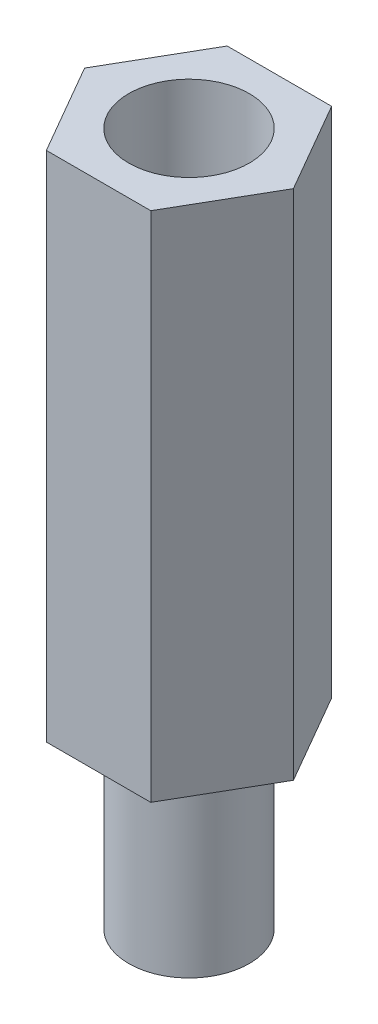
ISO-10303-21;
HEADER;
FILE_DESCRIPTION(('STEP AP214'),'2;1');
FILE_NAME('part.step','',(''),(''),'','','');
FILE_SCHEMA(('AUTOMOTIVE_DESIGN { 1 0 10303 214 1 1 1 1 }'));
ENDSEC;
DATA;
#1=APPLICATION_CONTEXT('core data for automotive mechanical design processes');
#2=APPLICATION_PROTOCOL_DEFINITION('international standard','automotive_design',2000,#1);
#3=PRODUCT_CONTEXT('',#1,'mechanical');
#4=PRODUCT('Part','Part','',(#3));
#5=PRODUCT_RELATED_PRODUCT_CATEGORY('part','',(#4));
#6=PRODUCT_DEFINITION_FORMATION('','',#4);
#7=PRODUCT_DEFINITION_CONTEXT('part definition',#1,'design');
#8=PRODUCT_DEFINITION('design','',#6,#7);
#9=PRODUCT_DEFINITION_SHAPE('','',#8);
#10=(LENGTH_UNIT() NAMED_UNIT(*) SI_UNIT(.MILLI.,.METRE.));
#11=(NAMED_UNIT(*) PLANE_ANGLE_UNIT() SI_UNIT($,.RADIAN.));
#12=(NAMED_UNIT(*) SI_UNIT($,.STERADIAN.) SOLID_ANGLE_UNIT());
#13=UNCERTAINTY_MEASURE_WITH_UNIT(LENGTH_MEASURE(1.E-05),#10,'distance_accuracy_value','');
#14=(GEOMETRIC_REPRESENTATION_CONTEXT(3) GLOBAL_UNCERTAINTY_ASSIGNED_CONTEXT((#13)) GLOBAL_UNIT_ASSIGNED_CONTEXT((#10,
#11,#12)) REPRESENTATION_CONTEXT('',''));
#15=CARTESIAN_POINT('',(0.,0.,0.));
#16=DIRECTION('',(0.,0.,1.));
#17=DIRECTION('',(1.,0.,0.));
#18=AXIS2_PLACEMENT_3D('',#15,#16,#17);
#19=CARTESIAN_POINT('',(0.,-6.,0.));
#20=DIRECTION('',(0.,1.,0.));
#21=DIRECTION('',(0.,0.,1.));
#22=AXIS2_PLACEMENT_3D('',#19,#20,#21);
#23=CYLINDRICAL_SURFACE('',#22,2.);
#24=CARTESIAN_POINT('',(0.,-6.,0.));
#25=DIRECTION('',(0.,1.,0.));
#26=DIRECTION('',(0.,0.,1.));
#27=AXIS2_PLACEMENT_3D('',#24,#25,#26);
#28=CIRCLE('',#27,2.);
#29=CARTESIAN_POINT('',(0.,-6.,2.));
#30=VERTEX_POINT('',#29);
#31=EDGE_CURVE('E11',#30,#30,#28,.T.);
#32=ORIENTED_EDGE('',*,*,#31,.T.);
#33=EDGE_LOOP('',(#32));
#34=FACE_BOUND('',#33,.T.);
#35=CARTESIAN_POINT('',(0.,0.,0.));
#36=DIRECTION('',(0.,1.,0.));
#37=DIRECTION('',(0.,0.,1.));
#38=AXIS2_PLACEMENT_3D('',#35,#36,#37);
#39=CIRCLE('',#38,2.);
#40=CARTESIAN_POINT('',(0.,0.,2.));
#41=VERTEX_POINT('',#40);
#42=EDGE_CURVE('E50',#41,#41,#39,.T.);
#43=ORIENTED_EDGE('',*,*,#42,.F.);
#44=EDGE_LOOP('',(#43));
#45=FACE_BOUND('',#44,.T.);
#46=ADVANCED_FACE('F47',(#34,#45),#23,.T.);
#47=CARTESIAN_POINT('',(0.,-6.,0.));
#48=DIRECTION('',(0.,1.,0.));
#49=DIRECTION('',(0.,0.,1.));
#50=AXIS2_PLACEMENT_3D('',#47,#48,#49);
#51=PLANE('',#50);
#52=ORIENTED_EDGE('',*,*,#31,.F.);
#53=EDGE_LOOP('',(#52));
#54=FACE_BOUND('',#53,.T.);
#55=ADVANCED_FACE('F62',(#54),#51,.F.);
#56=CARTESIAN_POINT('',(0.,0.,0.));
#57=DIRECTION('',(0.,1.,0.));
#58=DIRECTION('',(0.,0.,1.));
#59=AXIS2_PLACEMENT_3D('',#56,#57,#58);
#60=PLANE('',#59);
#61=ORIENTED_EDGE('',*,*,#42,.T.);
#62=EDGE_LOOP('',(#61));
#63=FACE_BOUND('',#62,.T.);
#64=ADVANCED_FACE('F59',(#63),#60,.T.);
#65=CLOSED_SHELL('',(#46,#55,#64));
#66=MANIFOLD_SOLID_BREP('B2',#65);
#67=CARTESIAN_POINT('',(0.,17.,0.));
#68=DIRECTION('',(0.,1.,0.));
#69=DIRECTION('',(0.,0.,1.));
#70=AXIS2_PLACEMENT_3D('',#67,#68,#69);
#71=PLANE('',#70);
#72=DIRECTION('',(0.5,0.,-0.866025403784439));
#73=VECTOR('',#72,1.);
#74=CARTESIAN_POINT('',(1.73205080756889,17.,3.));
#75=LINE('',#74,#73);
#76=CARTESIAN_POINT('',(1.73205080756889,17.,3.));
#77=VERTEX_POINT('',#76);
#78=CARTESIAN_POINT('',(3.46410161513776,17.,0.));
#79=VERTEX_POINT('',#78);
#80=EDGE_CURVE('E195',#77,#79,#75,.T.);
#81=ORIENTED_EDGE('',*,*,#80,.T.);
#82=DIRECTION('',(-0.499999999999999,0.,-0.866025403784439));
#83=VECTOR('',#82,1.);
#84=CARTESIAN_POINT('',(3.46410161513776,17.,0.));
#85=LINE('',#84,#83);
#86=CARTESIAN_POINT('',(1.73205080756888,17.,-3.));
#87=VERTEX_POINT('',#86);
#88=EDGE_CURVE('E143',#79,#87,#85,.T.);
#89=ORIENTED_EDGE('',*,*,#88,.T.);
#90=DIRECTION('',(-1.,0.,0.));
#91=VECTOR('',#90,1.);
#92=CARTESIAN_POINT('',(1.73205080756888,17.,-3.));
#93=LINE('',#92,#91);
#94=CARTESIAN_POINT('',(-1.73205080756888,17.,-3.));
#95=VERTEX_POINT('',#94);
#96=EDGE_CURVE('E156',#87,#95,#93,.T.);
#97=ORIENTED_EDGE('',*,*,#96,.T.);
#98=DIRECTION('',(-0.500000000000001,0.,0.866025403784438));
#99=VECTOR('',#98,1.);
#100=CARTESIAN_POINT('',(-1.73205080756888,17.,-3.));
#101=LINE('',#100,#99);
#102=CARTESIAN_POINT('',(-3.46410161513776,17.,0.));
#103=VERTEX_POINT('',#102);
#104=EDGE_CURVE('E150',#95,#103,#101,.T.);
#105=ORIENTED_EDGE('',*,*,#104,.T.);
#106=DIRECTION('',(0.5,0.,0.866025403784439));
#107=VECTOR('',#106,1.);
#108=CARTESIAN_POINT('',(-3.46410161513776,17.,0.));
#109=LINE('',#108,#107);
#110=CARTESIAN_POINT('',(-1.73205080756888,17.,3.));
#111=VERTEX_POINT('',#110);
#112=EDGE_CURVE('E154',#103,#111,#109,.T.);
#113=ORIENTED_EDGE('',*,*,#112,.T.);
#114=DIRECTION('',(1.,0.,0.));
#115=VECTOR('',#114,1.);
#116=CARTESIAN_POINT('',(-1.73205080756888,17.,3.));
#117=LINE('',#116,#115);
#118=EDGE_CURVE('E106',#111,#77,#117,.T.);
#119=ORIENTED_EDGE('',*,*,#118,.T.);
#120=EDGE_LOOP('',(#81,#89,#97,#105,#113,#119));
#121=FACE_BOUND('',#120,.T.);
#122=CARTESIAN_POINT('',(0.,17.,0.));
#123=DIRECTION('',(0.,1.,0.));
#124=DIRECTION('',(0.,0.,1.));
#125=AXIS2_PLACEMENT_3D('',#122,#123,#124);
#126=CIRCLE('',#125,2.);
#127=CARTESIAN_POINT('',(0.,17.,2.));
#128=VERTEX_POINT('',#127);
#129=EDGE_CURVE('E183',#128,#128,#126,.T.);
#130=ORIENTED_EDGE('',*,*,#129,.F.);
#131=EDGE_LOOP('',(#130));
#132=FACE_BOUND('',#131,.T.);
#133=ADVANCED_FACE('F88',(#121,#132),#71,.T.);
#134=CARTESIAN_POINT('',(0.,0.,0.));
#135=DIRECTION('',(0.,1.,0.));
#136=DIRECTION('',(0.,0.,1.));
#137=AXIS2_PLACEMENT_3D('',#134,#135,#136);
#138=PLANE('',#137);
#139=DIRECTION('',(0.5,0.,-0.866025403784439));
#140=VECTOR('',#139,1.);
#141=CARTESIAN_POINT('',(1.73205080756889,0.,3.));
#142=LINE('',#141,#140);
#143=CARTESIAN_POINT('',(1.73205080756889,0.,3.));
#144=VERTEX_POINT('',#143);
#145=CARTESIAN_POINT('',(3.46410161513776,0.,0.));
#146=VERTEX_POINT('',#145);
#147=EDGE_CURVE('E178',#144,#146,#142,.T.);
#148=ORIENTED_EDGE('',*,*,#147,.F.);
#149=DIRECTION('',(1.,0.,0.));
#150=VECTOR('',#149,1.);
#151=CARTESIAN_POINT('',(-1.73205080756888,0.,3.));
#152=LINE('',#151,#150);
#153=CARTESIAN_POINT('',(-1.73205080756888,0.,3.));
#154=VERTEX_POINT('',#153);
#155=EDGE_CURVE('E135',#154,#144,#152,.T.);
#156=ORIENTED_EDGE('',*,*,#155,.F.);
#157=DIRECTION('',(0.5,0.,0.866025403784439));
#158=VECTOR('',#157,1.);
#159=CARTESIAN_POINT('',(-3.46410161513776,0.,0.));
#160=LINE('',#159,#158);
#161=CARTESIAN_POINT('',(-3.46410161513776,0.,0.));
#162=VERTEX_POINT('',#161);
#163=EDGE_CURVE('E129',#162,#154,#160,.T.);
#164=ORIENTED_EDGE('',*,*,#163,.F.);
#165=DIRECTION('',(-0.500000000000001,0.,0.866025403784438));
#166=VECTOR('',#165,1.);
#167=CARTESIAN_POINT('',(-1.73205080756888,0.,-3.));
#168=LINE('',#167,#166);
#169=CARTESIAN_POINT('',(-1.73205080756888,0.,-3.));
#170=VERTEX_POINT('',#169);
#171=EDGE_CURVE('E165',#170,#162,#168,.T.);
#172=ORIENTED_EDGE('',*,*,#171,.F.);
#173=DIRECTION('',(-1.,0.,0.));
#174=VECTOR('',#173,1.);
#175=CARTESIAN_POINT('',(1.73205080756888,0.,-3.));
#176=LINE('',#175,#174);
#177=CARTESIAN_POINT('',(1.73205080756888,0.,-3.));
#178=VERTEX_POINT('',#177);
#179=EDGE_CURVE('E186',#178,#170,#176,.T.);
#180=ORIENTED_EDGE('',*,*,#179,.F.);
#181=DIRECTION('',(-0.499999999999999,0.,-0.866025403784439));
#182=VECTOR('',#181,1.);
#183=CARTESIAN_POINT('',(3.46410161513776,0.,0.));
#184=LINE('',#183,#182);
#185=EDGE_CURVE('E182',#146,#178,#184,.T.);
#186=ORIENTED_EDGE('',*,*,#185,.F.);
#187=EDGE_LOOP('',(#148,#156,#164,#172,#180,#186));
#188=FACE_BOUND('',#187,.T.);
#189=CARTESIAN_POINT('',(0.,0.,0.));
#190=DIRECTION('',(0.,1.,0.));
#191=DIRECTION('',(0.,0.,1.));
#192=AXIS2_PLACEMENT_3D('',#189,#190,#191);
#193=CIRCLE('',#192,2.);
#194=CARTESIAN_POINT('',(0.,0.,2.));
#195=VERTEX_POINT('',#194);
#196=EDGE_CURVE('E292',#195,#195,#193,.T.);
#197=ORIENTED_EDGE('',*,*,#196,.T.);
#198=EDGE_LOOP('',(#197));
#199=FACE_BOUND('',#198,.T.);
#200=ADVANCED_FACE('F208',(#188,#199),#138,.F.);
#201=CARTESIAN_POINT('',(1.73205080756889,17.,3.));
#202=DIRECTION('',(-0.866025403784439,0.,-0.5));
#203=DIRECTION('',(-0.5,0.,0.866025403784439));
#204=AXIS2_PLACEMENT_3D('',#201,#202,#203);
#205=PLANE('',#204);
#206=ORIENTED_EDGE('',*,*,#147,.T.);
#207=DIRECTION('',(0.,-1.,0.));
#208=VECTOR('',#207,1.);
#209=CARTESIAN_POINT('',(3.46410161513776,17.,0.));
#210=LINE('',#209,#208);
#211=EDGE_CURVE('E45',#79,#146,#210,.T.);
#212=ORIENTED_EDGE('',*,*,#211,.F.);
#213=ORIENTED_EDGE('',*,*,#80,.F.);
#214=DIRECTION('',(0.,-1.,0.));
#215=VECTOR('',#214,1.);
#216=CARTESIAN_POINT('',(1.73205080756889,17.,3.));
#217=LINE('',#216,#215);
#218=EDGE_CURVE('E174',#77,#144,#217,.T.);
#219=ORIENTED_EDGE('',*,*,#218,.T.);
#220=EDGE_LOOP('',(#206,#212,#213,#219));
#221=FACE_BOUND('',#220,.T.);
#222=ADVANCED_FACE('F90',(#221),#205,.F.);
#223=CARTESIAN_POINT('',(3.46410161513776,17.,0.));
#224=DIRECTION('',(-0.866025403784439,0.,0.5));
#225=DIRECTION('',(0.499999999999999,0.,0.866025403784439));
#226=AXIS2_PLACEMENT_3D('',#223,#224,#225);
#227=PLANE('',#226);
#228=ORIENTED_EDGE('',*,*,#185,.T.);
#229=DIRECTION('',(0.,-1.,0.));
#230=VECTOR('',#229,1.);
#231=CARTESIAN_POINT('',(1.73205080756888,17.,-3.));
#232=LINE('',#231,#230);
#233=EDGE_CURVE('E98',#87,#178,#232,.T.);
#234=ORIENTED_EDGE('',*,*,#233,.F.);
#235=ORIENTED_EDGE('',*,*,#88,.F.);
#236=ORIENTED_EDGE('',*,*,#211,.T.);
#237=EDGE_LOOP('',(#228,#234,#235,#236));
#238=FACE_BOUND('',#237,.T.);
#239=ADVANCED_FACE('F233',(#238),#227,.F.);
#240=CARTESIAN_POINT('',(1.73205080756888,17.,-3.));
#241=DIRECTION('',(0.,0.,1.));
#242=DIRECTION('',(1.,0.,0.));
#243=AXIS2_PLACEMENT_3D('',#240,#241,#242);
#244=PLANE('',#243);
#245=ORIENTED_EDGE('',*,*,#179,.T.);
#246=DIRECTION('',(0.,-1.,0.));
#247=VECTOR('',#246,1.);
#248=CARTESIAN_POINT('',(-1.73205080756888,17.,-3.));
#249=LINE('',#248,#247);
#250=EDGE_CURVE('E167',#95,#170,#249,.T.);
#251=ORIENTED_EDGE('',*,*,#250,.F.);
#252=ORIENTED_EDGE('',*,*,#96,.F.);
#253=ORIENTED_EDGE('',*,*,#233,.T.);
#254=EDGE_LOOP('',(#245,#251,#252,#253));
#255=FACE_BOUND('',#254,.T.);
#256=ADVANCED_FACE('F205',(#255),#244,.F.);
#257=CARTESIAN_POINT('',(-1.73205080756888,17.,-3.));
#258=DIRECTION('',(0.866025403784438,0.,0.500000000000001));
#259=DIRECTION('',(0.500000000000001,0.,-0.866025403784438));
#260=AXIS2_PLACEMENT_3D('',#257,#258,#259);
#261=PLANE('',#260);
#262=ORIENTED_EDGE('',*,*,#171,.T.);
#263=DIRECTION('',(0.,-1.,0.));
#264=VECTOR('',#263,1.);
#265=CARTESIAN_POINT('',(-3.46410161513776,17.,0.));
#266=LINE('',#265,#264);
#267=EDGE_CURVE('E162',#103,#162,#266,.T.);
#268=ORIENTED_EDGE('',*,*,#267,.F.);
#269=ORIENTED_EDGE('',*,*,#104,.F.);
#270=ORIENTED_EDGE('',*,*,#250,.T.);
#271=EDGE_LOOP('',(#262,#268,#269,#270));
#272=FACE_BOUND('',#271,.T.);
#273=ADVANCED_FACE('F163',(#272),#261,.F.);
#274=CARTESIAN_POINT('',(-3.46410161513776,17.,0.));
#275=DIRECTION('',(0.866025403784439,0.,-0.5));
#276=DIRECTION('',(-0.5,0.,-0.866025403784439));
#277=AXIS2_PLACEMENT_3D('',#274,#275,#276);
#278=PLANE('',#277);
#279=ORIENTED_EDGE('',*,*,#163,.T.);
#280=DIRECTION('',(0.,-1.,0.));
#281=VECTOR('',#280,1.);
#282=CARTESIAN_POINT('',(-1.73205080756888,17.,3.));
#283=LINE('',#282,#281);
#284=EDGE_CURVE('E168',#111,#154,#283,.T.);
#285=ORIENTED_EDGE('',*,*,#284,.F.);
#286=ORIENTED_EDGE('',*,*,#112,.F.);
#287=ORIENTED_EDGE('',*,*,#267,.T.);
#288=EDGE_LOOP('',(#279,#285,#286,#287));
#289=FACE_BOUND('',#288,.T.);
#290=ADVANCED_FACE('F170',(#289),#278,.F.);
#291=CARTESIAN_POINT('',(-1.73205080756888,17.,3.));
#292=DIRECTION('',(0.,0.,-1.));
#293=DIRECTION('',(-1.,0.,0.));
#294=AXIS2_PLACEMENT_3D('',#291,#292,#293);
#295=PLANE('',#294);
#296=ORIENTED_EDGE('',*,*,#155,.T.);
#297=ORIENTED_EDGE('',*,*,#218,.F.);
#298=ORIENTED_EDGE('',*,*,#118,.F.);
#299=ORIENTED_EDGE('',*,*,#284,.T.);
#300=EDGE_LOOP('',(#296,#297,#298,#299));
#301=FACE_BOUND('',#300,.T.);
#302=ADVANCED_FACE('F213',(#301),#295,.F.);
#303=CARTESIAN_POINT('',(0.,17.,0.));
#304=DIRECTION('',(0.,-1.,0.));
#305=DIRECTION('',(0.,0.,-1.));
#306=AXIS2_PLACEMENT_3D('',#303,#304,#305);
#307=CYLINDRICAL_SURFACE('',#306,2.);
#308=ORIENTED_EDGE('',*,*,#129,.T.);
#309=EDGE_LOOP('',(#308));
#310=FACE_BOUND('',#309,.T.);
#311=ORIENTED_EDGE('',*,*,#196,.F.);
#312=EDGE_LOOP('',(#311));
#313=FACE_BOUND('',#312,.T.);
#314=ADVANCED_FACE('F215',(#310,#313),#307,.F.);
#315=CLOSED_SHELL('',(#133,#200,#222,#239,#256,#273,#290,#302,#314));
#316=MANIFOLD_SOLID_BREP('B6',#315);
#317=ADVANCED_BREP_SHAPE_REPRESENTATION('',(#18,#66,#316),#14);
#318=SHAPE_DEFINITION_REPRESENTATION(#9,#317);
ENDSEC;
END-ISO-10303-21;
